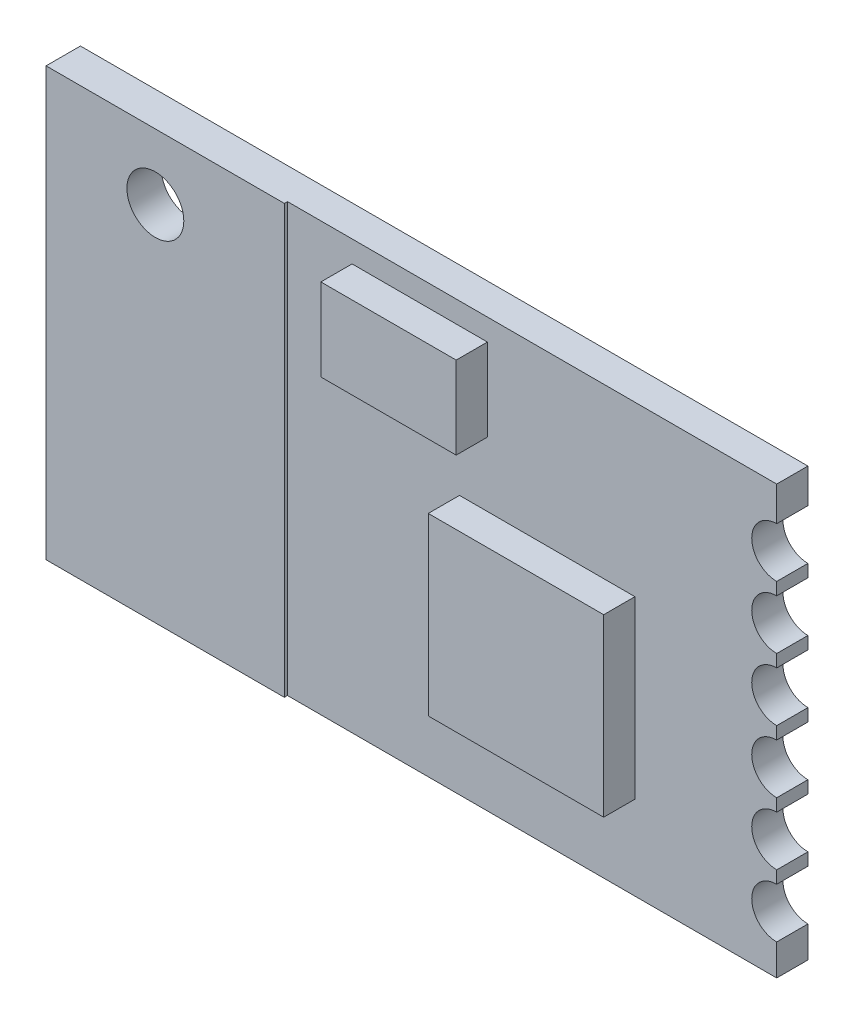
ISO-10303-21;
HEADER;
FILE_DESCRIPTION(('STEP AP214'),'2;1');
FILE_NAME('part.step','',(''),(''),'','','');
FILE_SCHEMA(('AUTOMOTIVE_DESIGN { 1 0 10303 214 1 1 1 1 }'));
ENDSEC;
DATA;
#1=APPLICATION_CONTEXT('core data for automotive mechanical design processes');
#2=APPLICATION_PROTOCOL_DEFINITION('international standard','automotive_design',2000,#1);
#3=PRODUCT_CONTEXT('',#1,'mechanical');
#4=PRODUCT('Part','Part','',(#3));
#5=PRODUCT_RELATED_PRODUCT_CATEGORY('part','',(#4));
#6=PRODUCT_DEFINITION_FORMATION('','',#4);
#7=PRODUCT_DEFINITION_CONTEXT('part definition',#1,'design');
#8=PRODUCT_DEFINITION('design','',#6,#7);
#9=PRODUCT_DEFINITION_SHAPE('','',#8);
#10=(LENGTH_UNIT() NAMED_UNIT(*) SI_UNIT(.MILLI.,.METRE.));
#11=(NAMED_UNIT(*) PLANE_ANGLE_UNIT() SI_UNIT($,.RADIAN.));
#12=(NAMED_UNIT(*) SI_UNIT($,.STERADIAN.) SOLID_ANGLE_UNIT());
#13=UNCERTAINTY_MEASURE_WITH_UNIT(LENGTH_MEASURE(1.E-05),#10,'distance_accuracy_value','');
#14=(GEOMETRIC_REPRESENTATION_CONTEXT(3) GLOBAL_UNCERTAINTY_ASSIGNED_CONTEXT((#13)) GLOBAL_UNIT_ASSIGNED_CONTEXT((#10,
#11,#12)) REPRESENTATION_CONTEXT('',''));
#15=CARTESIAN_POINT('',(0.,0.,0.));
#16=DIRECTION('',(0.,0.,1.));
#17=DIRECTION('',(1.,0.,0.));
#18=AXIS2_PLACEMENT_3D('',#15,#16,#17);
#19=CARTESIAN_POINT('',(23.3,-11.9,1.));
#20=DIRECTION('',(0.,0.,1.));
#21=DIRECTION('',(1.,0.,0.));
#22=AXIS2_PLACEMENT_3D('',#19,#20,#21);
#23=PLANE('',#22);
#24=DIRECTION('',(-1.,0.,0.));
#25=VECTOR('',#24,1.);
#26=CARTESIAN_POINT('',(0.,0.,1.));
#27=LINE('',#26,#25);
#28=CARTESIAN_POINT('',(23.3,0.,1.));
#29=VERTEX_POINT('',#28);
#30=CARTESIAN_POINT('',(7.63146684586983,0.,1.));
#31=VERTEX_POINT('',#30);
#32=EDGE_CURVE('E386',#29,#31,#27,.T.);
#33=ORIENTED_EDGE('',*,*,#32,.T.);
#34=DIRECTION('',(0.,-1.,0.));
#35=VECTOR('',#34,1.);
#36=CARTESIAN_POINT('',(7.63146684586983,0.,1.));
#37=LINE('',#36,#35);
#38=CARTESIAN_POINT('',(7.63146684586983,-13.7,1.));
#39=VERTEX_POINT('',#38);
#40=EDGE_CURVE('E310',#31,#39,#37,.T.);
#41=ORIENTED_EDGE('',*,*,#40,.T.);
#42=DIRECTION('',(1.,0.,0.));
#43=VECTOR('',#42,1.);
#44=CARTESIAN_POINT('',(0.,-13.7,1.));
#45=LINE('',#44,#43);
#46=CARTESIAN_POINT('',(23.3,-13.7,1.));
#47=VERTEX_POINT('',#46);
#48=EDGE_CURVE('E344',#39,#47,#45,.T.);
#49=ORIENTED_EDGE('',*,*,#48,.T.);
#50=DIRECTION('',(0.,1.,0.));
#51=VECTOR('',#50,1.);
#52=CARTESIAN_POINT('',(23.3,-12.7,1.));
#53=LINE('',#52,#51);
#54=CARTESIAN_POINT('',(23.3,-12.7,1.));
#55=VERTEX_POINT('',#54);
#56=EDGE_CURVE('E347',#47,#55,#53,.T.);
#57=ORIENTED_EDGE('',*,*,#56,.T.);
#58=CARTESIAN_POINT('',(23.3,-11.9,1.));
#59=DIRECTION('',(0.,0.,-1.));
#60=DIRECTION('',(1.,0.,0.));
#61=AXIS2_PLACEMENT_3D('',#58,#59,#60);
#62=CIRCLE('',#61,0.799999999999999);
#63=CARTESIAN_POINT('',(23.3,-11.1,1.));
#64=VERTEX_POINT('',#63);
#65=EDGE_CURVE('E351',#55,#64,#62,.T.);
#66=ORIENTED_EDGE('',*,*,#65,.T.);
#67=DIRECTION('',(0.,1.,0.));
#68=VECTOR('',#67,1.);
#69=CARTESIAN_POINT('',(23.3,-10.7,1.));
#70=LINE('',#69,#68);
#71=CARTESIAN_POINT('',(23.3,-10.7,1.));
#72=VERTEX_POINT('',#71);
#73=EDGE_CURVE('E354',#64,#72,#70,.T.);
#74=ORIENTED_EDGE('',*,*,#73,.T.);
#75=CARTESIAN_POINT('',(23.3,-9.9,1.));
#76=DIRECTION('',(0.,0.,-1.));
#77=DIRECTION('',(1.,0.,0.));
#78=AXIS2_PLACEMENT_3D('',#75,#76,#77);
#79=CIRCLE('',#78,0.799999999999999);
#80=CARTESIAN_POINT('',(23.3,-9.1,1.));
#81=VERTEX_POINT('',#80);
#82=EDGE_CURVE('E357',#72,#81,#79,.T.);
#83=ORIENTED_EDGE('',*,*,#82,.T.);
#84=DIRECTION('',(0.,1.,0.));
#85=VECTOR('',#84,1.);
#86=CARTESIAN_POINT('',(23.3,-8.7,1.));
#87=LINE('',#86,#85);
#88=CARTESIAN_POINT('',(23.3,-8.7,1.));
#89=VERTEX_POINT('',#88);
#90=EDGE_CURVE('E360',#81,#89,#87,.T.);
#91=ORIENTED_EDGE('',*,*,#90,.T.);
#92=CARTESIAN_POINT('',(23.3,-7.9,1.));
#93=DIRECTION('',(0.,0.,-1.));
#94=DIRECTION('',(1.,0.,0.));
#95=AXIS2_PLACEMENT_3D('',#92,#93,#94);
#96=CIRCLE('',#95,0.799999999999999);
#97=CARTESIAN_POINT('',(23.3,-7.1,1.));
#98=VERTEX_POINT('',#97);
#99=EDGE_CURVE('E363',#89,#98,#96,.T.);
#100=ORIENTED_EDGE('',*,*,#99,.T.);
#101=DIRECTION('',(0.,1.,0.));
#102=VECTOR('',#101,1.);
#103=CARTESIAN_POINT('',(23.3,-6.7,1.));
#104=LINE('',#103,#102);
#105=CARTESIAN_POINT('',(23.3,-6.7,1.));
#106=VERTEX_POINT('',#105);
#107=EDGE_CURVE('E366',#98,#106,#104,.T.);
#108=ORIENTED_EDGE('',*,*,#107,.T.);
#109=CARTESIAN_POINT('',(23.3,-5.9,1.));
#110=DIRECTION('',(0.,0.,-1.));
#111=DIRECTION('',(1.,0.,0.));
#112=AXIS2_PLACEMENT_3D('',#109,#110,#111);
#113=CIRCLE('',#112,0.799999999999999);
#114=CARTESIAN_POINT('',(23.3,-5.1,1.));
#115=VERTEX_POINT('',#114);
#116=EDGE_CURVE('E369',#106,#115,#113,.T.);
#117=ORIENTED_EDGE('',*,*,#116,.T.);
#118=DIRECTION('',(0.,1.,0.));
#119=VECTOR('',#118,1.);
#120=CARTESIAN_POINT('',(23.3,-4.7,1.));
#121=LINE('',#120,#119);
#122=CARTESIAN_POINT('',(23.3,-4.7,1.));
#123=VERTEX_POINT('',#122);
#124=EDGE_CURVE('E372',#115,#123,#121,.T.);
#125=ORIENTED_EDGE('',*,*,#124,.T.);
#126=CARTESIAN_POINT('',(23.3,-3.9,1.));
#127=DIRECTION('',(0.,0.,-1.));
#128=DIRECTION('',(1.,0.,0.));
#129=AXIS2_PLACEMENT_3D('',#126,#127,#128);
#130=CIRCLE('',#129,0.799999999999999);
#131=CARTESIAN_POINT('',(23.3,-3.1,1.));
#132=VERTEX_POINT('',#131);
#133=EDGE_CURVE('E375',#123,#132,#130,.T.);
#134=ORIENTED_EDGE('',*,*,#133,.T.);
#135=DIRECTION('',(0.,1.,0.));
#136=VECTOR('',#135,1.);
#137=CARTESIAN_POINT('',(23.3,-2.7,1.));
#138=LINE('',#137,#136);
#139=CARTESIAN_POINT('',(23.3,-2.7,1.));
#140=VERTEX_POINT('',#139);
#141=EDGE_CURVE('E378',#132,#140,#138,.T.);
#142=ORIENTED_EDGE('',*,*,#141,.T.);
#143=CARTESIAN_POINT('',(23.3,-1.9,1.));
#144=DIRECTION('',(0.,0.,-1.));
#145=DIRECTION('',(1.,0.,0.));
#146=AXIS2_PLACEMENT_3D('',#143,#144,#145);
#147=CIRCLE('',#146,0.799999999999998);
#148=CARTESIAN_POINT('',(23.3,-1.1,1.));
#149=VERTEX_POINT('',#148);
#150=EDGE_CURVE('E380',#140,#149,#147,.T.);
#151=ORIENTED_EDGE('',*,*,#150,.T.);
#152=DIRECTION('',(0.,1.,0.));
#153=VECTOR('',#152,1.);
#154=CARTESIAN_POINT('',(23.3,0.,1.));
#155=LINE('',#154,#153);
#156=EDGE_CURVE('E383',#149,#29,#155,.T.);
#157=ORIENTED_EDGE('',*,*,#156,.T.);
#158=EDGE_LOOP('',(#33,#41,#49,#57,#66,#74,#83,#91,#100,#108,#117,#125,#134,#142,#151,#157));
#159=FACE_BOUND('',#158,.T.);
#160=DIRECTION('',(-1.,0.,0.));
#161=VECTOR('',#160,1.);
#162=CARTESIAN_POINT('',(23.3,-11.0117848365072,1.));
#163=LINE('',#162,#161);
#164=CARTESIAN_POINT('',(18.7582826408663,-11.0117848365072,1.));
#165=VERTEX_POINT('',#164);
#166=CARTESIAN_POINT('',(13.1404463601816,-11.0117848365072,1.));
#167=VERTEX_POINT('',#166);
#168=EDGE_CURVE('E303',#165,#167,#163,.T.);
#169=ORIENTED_EDGE('',*,*,#168,.T.);
#170=DIRECTION('',(0.,1.,0.));
#171=VECTOR('',#170,1.);
#172=CARTESIAN_POINT('',(13.1404463601816,-11.9,1.));
#173=LINE('',#172,#171);
#174=CARTESIAN_POINT('',(13.1404463601816,-5.39394855582256,1.));
#175=VERTEX_POINT('',#174);
#176=EDGE_CURVE('E307',#167,#175,#173,.T.);
#177=ORIENTED_EDGE('',*,*,#176,.T.);
#178=DIRECTION('',(1.,0.,0.));
#179=VECTOR('',#178,1.);
#180=CARTESIAN_POINT('',(23.3,-5.39394855582256,1.));
#181=LINE('',#180,#179);
#182=CARTESIAN_POINT('',(18.7582826408663,-5.39394855582256,1.));
#183=VERTEX_POINT('',#182);
#184=EDGE_CURVE('E295',#175,#183,#181,.T.);
#185=ORIENTED_EDGE('',*,*,#184,.T.);
#186=DIRECTION('',(0.,-1.,0.));
#187=VECTOR('',#186,1.);
#188=CARTESIAN_POINT('',(18.7582826408663,-11.9,1.));
#189=LINE('',#188,#187);
#190=EDGE_CURVE('E299',#183,#165,#189,.T.);
#191=ORIENTED_EDGE('',*,*,#190,.T.);
#192=EDGE_LOOP('',(#169,#177,#185,#191));
#193=FACE_BOUND('',#192,.T.);
#194=DIRECTION('',(-1.,0.,0.));
#195=VECTOR('',#194,1.);
#196=CARTESIAN_POINT('',(23.3,-3.33025359557106,1.));
#197=LINE('',#196,#195);
#198=CARTESIAN_POINT('',(14.0347141762906,-3.33025359557106,1.));
#199=VERTEX_POINT('',#198);
#200=CARTESIAN_POINT('',(9.70095475976247,-3.33025359557106,1.));
#201=VERTEX_POINT('',#200);
#202=EDGE_CURVE('E263',#199,#201,#197,.T.);
#203=ORIENTED_EDGE('',*,*,#202,.T.);
#204=DIRECTION('',(0.,1.,0.));
#205=VECTOR('',#204,1.);
#206=CARTESIAN_POINT('',(9.70095475976247,-11.9,1.));
#207=LINE('',#206,#205);
#208=CARTESIAN_POINT('',(9.70095475976247,-0.693310035249692,1.));
#209=VERTEX_POINT('',#208);
#210=EDGE_CURVE('E245',#201,#209,#207,.T.);
#211=ORIENTED_EDGE('',*,*,#210,.T.);
#212=DIRECTION('',(1.,0.,0.));
#213=VECTOR('',#212,1.);
#214=CARTESIAN_POINT('',(23.3,-0.693310035249693,1.));
#215=LINE('',#214,#213);
#216=CARTESIAN_POINT('',(14.0347141762906,-0.693310035249693,1.));
#217=VERTEX_POINT('',#216);
#218=EDGE_CURVE('E247',#209,#217,#215,.T.);
#219=ORIENTED_EDGE('',*,*,#218,.T.);
#220=DIRECTION('',(0.,-1.,0.));
#221=VECTOR('',#220,1.);
#222=CARTESIAN_POINT('',(14.0347141762906,-11.9,1.));
#223=LINE('',#222,#221);
#224=EDGE_CURVE('E254',#217,#199,#223,.T.);
#225=ORIENTED_EDGE('',*,*,#224,.T.);
#226=EDGE_LOOP('',(#203,#211,#219,#225));
#227=FACE_BOUND('',#226,.T.);
#228=ADVANCED_FACE('F45',(#159,#193,#227),#23,.T.);
#229=CARTESIAN_POINT('',(23.3,-11.9,0.));
#230=DIRECTION('',(0.,0.,1.));
#231=DIRECTION('',(1.,0.,0.));
#232=AXIS2_PLACEMENT_3D('',#229,#230,#231);
#233=PLANE('',#232);
#234=DIRECTION('',(0.,-1.,0.));
#235=VECTOR('',#234,1.);
#236=CARTESIAN_POINT('',(0.,0.,0.));
#237=LINE('',#236,#235);
#238=CARTESIAN_POINT('',(0.,0.,0.));
#239=VERTEX_POINT('',#238);
#240=CARTESIAN_POINT('',(0.,-13.7,0.));
#241=VERTEX_POINT('',#240);
#242=EDGE_CURVE('E343',#239,#241,#237,.T.);
#243=ORIENTED_EDGE('',*,*,#242,.F.);
#244=DIRECTION('',(-1.,0.,0.));
#245=VECTOR('',#244,1.);
#246=CARTESIAN_POINT('',(0.,0.,0.));
#247=LINE('',#246,#245);
#248=CARTESIAN_POINT('',(23.3,0.,0.));
#249=VERTEX_POINT('',#248);
#250=EDGE_CURVE('E348',#249,#239,#247,.T.);
#251=ORIENTED_EDGE('',*,*,#250,.F.);
#252=DIRECTION('',(0.,1.,0.));
#253=VECTOR('',#252,1.);
#254=CARTESIAN_POINT('',(23.3,0.,0.));
#255=LINE('',#254,#253);
#256=CARTESIAN_POINT('',(23.3,-1.1,0.));
#257=VERTEX_POINT('',#256);
#258=EDGE_CURVE('E433',#257,#249,#255,.T.);
#259=ORIENTED_EDGE('',*,*,#258,.F.);
#260=CARTESIAN_POINT('',(23.3,-1.9,0.));
#261=DIRECTION('',(0.,0.,-1.));
#262=DIRECTION('',(1.,0.,0.));
#263=AXIS2_PLACEMENT_3D('',#260,#261,#262);
#264=CIRCLE('',#263,0.799999999999998);
#265=CARTESIAN_POINT('',(23.3,-2.7,0.));
#266=VERTEX_POINT('',#265);
#267=EDGE_CURVE('E430',#266,#257,#264,.T.);
#268=ORIENTED_EDGE('',*,*,#267,.F.);
#269=DIRECTION('',(0.,1.,0.));
#270=VECTOR('',#269,1.);
#271=CARTESIAN_POINT('',(23.3,-2.7,0.));
#272=LINE('',#271,#270);
#273=CARTESIAN_POINT('',(23.3,-3.1,0.));
#274=VERTEX_POINT('',#273);
#275=EDGE_CURVE('E427',#274,#266,#272,.T.);
#276=ORIENTED_EDGE('',*,*,#275,.F.);
#277=CARTESIAN_POINT('',(23.3,-3.9,0.));
#278=DIRECTION('',(0.,0.,-1.));
#279=DIRECTION('',(1.,0.,0.));
#280=AXIS2_PLACEMENT_3D('',#277,#278,#279);
#281=CIRCLE('',#280,0.799999999999999);
#282=CARTESIAN_POINT('',(23.3,-4.7,0.));
#283=VERTEX_POINT('',#282);
#284=EDGE_CURVE('E424',#283,#274,#281,.T.);
#285=ORIENTED_EDGE('',*,*,#284,.F.);
#286=DIRECTION('',(0.,1.,0.));
#287=VECTOR('',#286,1.);
#288=CARTESIAN_POINT('',(23.3,-4.7,0.));
#289=LINE('',#288,#287);
#290=CARTESIAN_POINT('',(23.3,-5.1,0.));
#291=VERTEX_POINT('',#290);
#292=EDGE_CURVE('E421',#291,#283,#289,.T.);
#293=ORIENTED_EDGE('',*,*,#292,.F.);
#294=CARTESIAN_POINT('',(23.3,-5.9,0.));
#295=DIRECTION('',(0.,0.,-1.));
#296=DIRECTION('',(1.,0.,0.));
#297=AXIS2_PLACEMENT_3D('',#294,#295,#296);
#298=CIRCLE('',#297,0.799999999999999);
#299=CARTESIAN_POINT('',(23.3,-6.7,0.));
#300=VERTEX_POINT('',#299);
#301=EDGE_CURVE('E418',#300,#291,#298,.T.);
#302=ORIENTED_EDGE('',*,*,#301,.F.);
#303=DIRECTION('',(0.,1.,0.));
#304=VECTOR('',#303,1.);
#305=CARTESIAN_POINT('',(23.3,-6.7,0.));
#306=LINE('',#305,#304);
#307=CARTESIAN_POINT('',(23.3,-7.1,0.));
#308=VERTEX_POINT('',#307);
#309=EDGE_CURVE('E415',#308,#300,#306,.T.);
#310=ORIENTED_EDGE('',*,*,#309,.F.);
#311=CARTESIAN_POINT('',(23.3,-7.9,0.));
#312=DIRECTION('',(0.,0.,-1.));
#313=DIRECTION('',(1.,0.,0.));
#314=AXIS2_PLACEMENT_3D('',#311,#312,#313);
#315=CIRCLE('',#314,0.799999999999999);
#316=CARTESIAN_POINT('',(23.3,-8.7,0.));
#317=VERTEX_POINT('',#316);
#318=EDGE_CURVE('E412',#317,#308,#315,.T.);
#319=ORIENTED_EDGE('',*,*,#318,.F.);
#320=DIRECTION('',(0.,1.,0.));
#321=VECTOR('',#320,1.);
#322=CARTESIAN_POINT('',(23.3,-8.7,0.));
#323=LINE('',#322,#321);
#324=CARTESIAN_POINT('',(23.3,-9.1,0.));
#325=VERTEX_POINT('',#324);
#326=EDGE_CURVE('E409',#325,#317,#323,.T.);
#327=ORIENTED_EDGE('',*,*,#326,.F.);
#328=CARTESIAN_POINT('',(23.3,-9.9,0.));
#329=DIRECTION('',(0.,0.,-1.));
#330=DIRECTION('',(1.,0.,0.));
#331=AXIS2_PLACEMENT_3D('',#328,#329,#330);
#332=CIRCLE('',#331,0.799999999999999);
#333=CARTESIAN_POINT('',(23.3,-10.7,0.));
#334=VERTEX_POINT('',#333);
#335=EDGE_CURVE('E406',#334,#325,#332,.T.);
#336=ORIENTED_EDGE('',*,*,#335,.F.);
#337=DIRECTION('',(0.,1.,0.));
#338=VECTOR('',#337,1.);
#339=CARTESIAN_POINT('',(23.3,-10.7,0.));
#340=LINE('',#339,#338);
#341=CARTESIAN_POINT('',(23.3,-11.1,0.));
#342=VERTEX_POINT('',#341);
#343=EDGE_CURVE('E403',#342,#334,#340,.T.);
#344=ORIENTED_EDGE('',*,*,#343,.F.);
#345=CARTESIAN_POINT('',(23.3,-11.9,0.));
#346=DIRECTION('',(0.,0.,-1.));
#347=DIRECTION('',(1.,0.,0.));
#348=AXIS2_PLACEMENT_3D('',#345,#346,#347);
#349=CIRCLE('',#348,0.799999999999999);
#350=CARTESIAN_POINT('',(23.3,-12.7,0.));
#351=VERTEX_POINT('',#350);
#352=EDGE_CURVE('E400',#351,#342,#349,.T.);
#353=ORIENTED_EDGE('',*,*,#352,.F.);
#354=DIRECTION('',(0.,1.,0.));
#355=VECTOR('',#354,1.);
#356=CARTESIAN_POINT('',(23.3,-12.7,0.));
#357=LINE('',#356,#355);
#358=CARTESIAN_POINT('',(23.3,-13.7,0.));
#359=VERTEX_POINT('',#358);
#360=EDGE_CURVE('E397',#359,#351,#357,.T.);
#361=ORIENTED_EDGE('',*,*,#360,.F.);
#362=DIRECTION('',(1.,0.,0.));
#363=VECTOR('',#362,1.);
#364=CARTESIAN_POINT('',(0.,-13.7,0.));
#365=LINE('',#364,#363);
#366=EDGE_CURVE('E394',#241,#359,#365,.T.);
#367=ORIENTED_EDGE('',*,*,#366,.F.);
#368=EDGE_LOOP('',(#243,#251,#259,#268,#276,#285,#293,#302,#310,#319,#327,#336,#344,#353,#361,#367));
#369=FACE_BOUND('',#368,.T.);
#370=CARTESIAN_POINT('',(3.5,-2.1,0.));
#371=DIRECTION('',(0.,0.,1.));
#372=DIRECTION('',(1.,0.,0.));
#373=AXIS2_PLACEMENT_3D('',#370,#371,#372);
#374=CIRCLE('',#373,0.911145060736606);
#375=CARTESIAN_POINT('',(4.41114506073661,-2.1,0.));
#376=VERTEX_POINT('',#375);
#377=EDGE_CURVE('E339',#376,#376,#374,.T.);
#378=ORIENTED_EDGE('',*,*,#377,.T.);
#379=EDGE_LOOP('',(#378));
#380=FACE_BOUND('',#379,.T.);
#381=ADVANCED_FACE('F506',(#369,#380),#233,.F.);
#382=CARTESIAN_POINT('',(0.,0.,1.));
#383=DIRECTION('',(1.,0.,0.));
#384=DIRECTION('',(0.,1.,0.));
#385=AXIS2_PLACEMENT_3D('',#382,#383,#384);
#386=PLANE('',#385);
#387=ORIENTED_EDGE('',*,*,#242,.T.);
#388=DIRECTION('',(0.,0.,-1.));
#389=VECTOR('',#388,1.);
#390=CARTESIAN_POINT('',(0.,-13.7,1.));
#391=LINE('',#390,#389);
#392=CARTESIAN_POINT('',(0.,-13.7,1.1));
#393=VERTEX_POINT('',#392);
#394=EDGE_CURVE('E11',#393,#241,#391,.T.);
#395=ORIENTED_EDGE('',*,*,#394,.F.);
#396=DIRECTION('',(0.,-1.,0.));
#397=VECTOR('',#396,1.);
#398=CARTESIAN_POINT('',(0.,0.,1.1));
#399=LINE('',#398,#397);
#400=CARTESIAN_POINT('',(0.,0.,1.1));
#401=VERTEX_POINT('',#400);
#402=EDGE_CURVE('E319',#401,#393,#399,.T.);
#403=ORIENTED_EDGE('',*,*,#402,.F.);
#404=DIRECTION('',(0.,0.,-1.));
#405=VECTOR('',#404,1.);
#406=CARTESIAN_POINT('',(0.,0.,1.));
#407=LINE('',#406,#405);
#408=EDGE_CURVE('E390',#401,#239,#407,.T.);
#409=ORIENTED_EDGE('',*,*,#408,.T.);
#410=EDGE_LOOP('',(#387,#395,#403,#409));
#411=FACE_BOUND('',#410,.T.);
#412=ADVANCED_FACE('F47',(#411),#386,.F.);
#413=CARTESIAN_POINT('',(0.,-13.7,1.));
#414=DIRECTION('',(0.,1.,0.));
#415=DIRECTION('',(0.,0.,1.));
#416=AXIS2_PLACEMENT_3D('',#413,#414,#415);
#417=PLANE('',#416);
#418=ORIENTED_EDGE('',*,*,#366,.T.);
#419=DIRECTION('',(0.,0.,-1.));
#420=VECTOR('',#419,1.);
#421=CARTESIAN_POINT('',(23.3,-13.7,1.));
#422=LINE('',#421,#420);
#423=EDGE_CURVE('E54',#47,#359,#422,.T.);
#424=ORIENTED_EDGE('',*,*,#423,.F.);
#425=ORIENTED_EDGE('',*,*,#48,.F.);
#426=DIRECTION('',(0.,0.,-1.));
#427=VECTOR('',#426,1.);
#428=CARTESIAN_POINT('',(7.63146684586983,-13.7,1.1));
#429=LINE('',#428,#427);
#430=CARTESIAN_POINT('',(7.63146684586983,-13.7,1.1));
#431=VERTEX_POINT('',#430);
#432=EDGE_CURVE('E330',#431,#39,#429,.T.);
#433=ORIENTED_EDGE('',*,*,#432,.F.);
#434=DIRECTION('',(1.,0.,0.));
#435=VECTOR('',#434,1.);
#436=CARTESIAN_POINT('',(0.,-13.7,1.1));
#437=LINE('',#436,#435);
#438=EDGE_CURVE('E323',#393,#431,#437,.T.);
#439=ORIENTED_EDGE('',*,*,#438,.F.);
#440=ORIENTED_EDGE('',*,*,#394,.T.);
#441=EDGE_LOOP('',(#418,#424,#425,#433,#439,#440));
#442=FACE_BOUND('',#441,.T.);
#443=ADVANCED_FACE('F524',(#442),#417,.F.);
#444=CARTESIAN_POINT('',(23.3,-12.7,1.));
#445=DIRECTION('',(-1.,0.,0.));
#446=DIRECTION('',(0.,0.,1.));
#447=AXIS2_PLACEMENT_3D('',#444,#445,#446);
#448=PLANE('',#447);
#449=ORIENTED_EDGE('',*,*,#360,.T.);
#450=DIRECTION('',(0.,0.,-1.));
#451=VECTOR('',#450,1.);
#452=CARTESIAN_POINT('',(23.3,-12.7,1.));
#453=LINE('',#452,#451);
#454=EDGE_CURVE('E489',#55,#351,#453,.T.);
#455=ORIENTED_EDGE('',*,*,#454,.F.);
#456=ORIENTED_EDGE('',*,*,#56,.F.);
#457=ORIENTED_EDGE('',*,*,#423,.T.);
#458=EDGE_LOOP('',(#449,#455,#456,#457));
#459=FACE_BOUND('',#458,.T.);
#460=ADVANCED_FACE('F499',(#459),#448,.F.);
#461=CARTESIAN_POINT('',(23.3,-11.9,1.));
#462=DIRECTION('',(0.,0.,-1.));
#463=DIRECTION('',(-1.,0.,0.));
#464=AXIS2_PLACEMENT_3D('',#461,#462,#463);
#465=CYLINDRICAL_SURFACE('',#464,0.799999999999999);
#466=ORIENTED_EDGE('',*,*,#352,.T.);
#467=DIRECTION('',(0.,0.,-1.));
#468=VECTOR('',#467,1.);
#469=CARTESIAN_POINT('',(23.3,-11.1,1.));
#470=LINE('',#469,#468);
#471=EDGE_CURVE('E485',#64,#342,#470,.T.);
#472=ORIENTED_EDGE('',*,*,#471,.F.);
#473=ORIENTED_EDGE('',*,*,#65,.F.);
#474=ORIENTED_EDGE('',*,*,#454,.T.);
#475=EDGE_LOOP('',(#466,#472,#473,#474));
#476=FACE_BOUND('',#475,.T.);
#477=ADVANCED_FACE('F512',(#476),#465,.F.);
#478=CARTESIAN_POINT('',(23.3,-10.7,1.));
#479=DIRECTION('',(-1.,0.,0.));
#480=DIRECTION('',(0.,0.,1.));
#481=AXIS2_PLACEMENT_3D('',#478,#479,#480);
#482=PLANE('',#481);
#483=ORIENTED_EDGE('',*,*,#343,.T.);
#484=DIRECTION('',(0.,0.,-1.));
#485=VECTOR('',#484,1.);
#486=CARTESIAN_POINT('',(23.3,-10.7,1.));
#487=LINE('',#486,#485);
#488=EDGE_CURVE('E481',#72,#334,#487,.T.);
#489=ORIENTED_EDGE('',*,*,#488,.F.);
#490=ORIENTED_EDGE('',*,*,#73,.F.);
#491=ORIENTED_EDGE('',*,*,#471,.T.);
#492=EDGE_LOOP('',(#483,#489,#490,#491));
#493=FACE_BOUND('',#492,.T.);
#494=ADVANCED_FACE('F516',(#493),#482,.F.);
#495=CARTESIAN_POINT('',(23.3,-9.9,1.));
#496=DIRECTION('',(0.,0.,-1.));
#497=DIRECTION('',(-1.,0.,0.));
#498=AXIS2_PLACEMENT_3D('',#495,#496,#497);
#499=CYLINDRICAL_SURFACE('',#498,0.799999999999999);
#500=ORIENTED_EDGE('',*,*,#335,.T.);
#501=DIRECTION('',(0.,0.,-1.));
#502=VECTOR('',#501,1.);
#503=CARTESIAN_POINT('',(23.3,-9.1,1.));
#504=LINE('',#503,#502);
#505=EDGE_CURVE('E477',#81,#325,#504,.T.);
#506=ORIENTED_EDGE('',*,*,#505,.F.);
#507=ORIENTED_EDGE('',*,*,#82,.F.);
#508=ORIENTED_EDGE('',*,*,#488,.T.);
#509=EDGE_LOOP('',(#500,#506,#507,#508));
#510=FACE_BOUND('',#509,.T.);
#511=ADVANCED_FACE('F585',(#510),#499,.F.);
#512=CARTESIAN_POINT('',(23.3,-8.7,1.));
#513=DIRECTION('',(-1.,0.,0.));
#514=DIRECTION('',(0.,0.,1.));
#515=AXIS2_PLACEMENT_3D('',#512,#513,#514);
#516=PLANE('',#515);
#517=ORIENTED_EDGE('',*,*,#326,.T.);
#518=DIRECTION('',(0.,0.,-1.));
#519=VECTOR('',#518,1.);
#520=CARTESIAN_POINT('',(23.3,-8.7,1.));
#521=LINE('',#520,#519);
#522=EDGE_CURVE('E473',#89,#317,#521,.T.);
#523=ORIENTED_EDGE('',*,*,#522,.F.);
#524=ORIENTED_EDGE('',*,*,#90,.F.);
#525=ORIENTED_EDGE('',*,*,#505,.T.);
#526=EDGE_LOOP('',(#517,#523,#524,#525));
#527=FACE_BOUND('',#526,.T.);
#528=ADVANCED_FACE('F582',(#527),#516,.F.);
#529=CARTESIAN_POINT('',(23.3,-7.9,1.));
#530=DIRECTION('',(0.,0.,-1.));
#531=DIRECTION('',(-1.,0.,0.));
#532=AXIS2_PLACEMENT_3D('',#529,#530,#531);
#533=CYLINDRICAL_SURFACE('',#532,0.799999999999999);
#534=ORIENTED_EDGE('',*,*,#318,.T.);
#535=DIRECTION('',(0.,0.,-1.));
#536=VECTOR('',#535,1.);
#537=CARTESIAN_POINT('',(23.3,-7.1,1.));
#538=LINE('',#537,#536);
#539=EDGE_CURVE('E469',#98,#308,#538,.T.);
#540=ORIENTED_EDGE('',*,*,#539,.F.);
#541=ORIENTED_EDGE('',*,*,#99,.F.);
#542=ORIENTED_EDGE('',*,*,#522,.T.);
#543=EDGE_LOOP('',(#534,#540,#541,#542));
#544=FACE_BOUND('',#543,.T.);
#545=ADVANCED_FACE('F578',(#544),#533,.F.);
#546=CARTESIAN_POINT('',(23.3,-6.7,1.));
#547=DIRECTION('',(-1.,0.,0.));
#548=DIRECTION('',(0.,0.,1.));
#549=AXIS2_PLACEMENT_3D('',#546,#547,#548);
#550=PLANE('',#549);
#551=ORIENTED_EDGE('',*,*,#309,.T.);
#552=DIRECTION('',(0.,0.,-1.));
#553=VECTOR('',#552,1.);
#554=CARTESIAN_POINT('',(23.3,-6.7,1.));
#555=LINE('',#554,#553);
#556=EDGE_CURVE('E465',#106,#300,#555,.T.);
#557=ORIENTED_EDGE('',*,*,#556,.F.);
#558=ORIENTED_EDGE('',*,*,#107,.F.);
#559=ORIENTED_EDGE('',*,*,#539,.T.);
#560=EDGE_LOOP('',(#551,#557,#558,#559));
#561=FACE_BOUND('',#560,.T.);
#562=ADVANCED_FACE('F574',(#561),#550,.F.);
#563=CARTESIAN_POINT('',(23.3,-5.9,1.));
#564=DIRECTION('',(0.,0.,-1.));
#565=DIRECTION('',(-1.,0.,0.));
#566=AXIS2_PLACEMENT_3D('',#563,#564,#565);
#567=CYLINDRICAL_SURFACE('',#566,0.799999999999999);
#568=ORIENTED_EDGE('',*,*,#301,.T.);
#569=DIRECTION('',(0.,0.,-1.));
#570=VECTOR('',#569,1.);
#571=CARTESIAN_POINT('',(23.3,-5.1,1.));
#572=LINE('',#571,#570);
#573=EDGE_CURVE('E461',#115,#291,#572,.T.);
#574=ORIENTED_EDGE('',*,*,#573,.F.);
#575=ORIENTED_EDGE('',*,*,#116,.F.);
#576=ORIENTED_EDGE('',*,*,#556,.T.);
#577=EDGE_LOOP('',(#568,#574,#575,#576));
#578=FACE_BOUND('',#577,.T.);
#579=ADVANCED_FACE('F569',(#578),#567,.F.);
#580=CARTESIAN_POINT('',(23.3,-4.7,1.));
#581=DIRECTION('',(-1.,0.,0.));
#582=DIRECTION('',(0.,0.,1.));
#583=AXIS2_PLACEMENT_3D('',#580,#581,#582);
#584=PLANE('',#583);
#585=ORIENTED_EDGE('',*,*,#292,.T.);
#586=DIRECTION('',(0.,0.,-1.));
#587=VECTOR('',#586,1.);
#588=CARTESIAN_POINT('',(23.3,-4.7,1.));
#589=LINE('',#588,#587);
#590=EDGE_CURVE('E457',#123,#283,#589,.T.);
#591=ORIENTED_EDGE('',*,*,#590,.F.);
#592=ORIENTED_EDGE('',*,*,#124,.F.);
#593=ORIENTED_EDGE('',*,*,#573,.T.);
#594=EDGE_LOOP('',(#585,#591,#592,#593));
#595=FACE_BOUND('',#594,.T.);
#596=ADVANCED_FACE('F563',(#595),#584,.F.);
#597=CARTESIAN_POINT('',(23.3,-3.9,1.));
#598=DIRECTION('',(0.,0.,-1.));
#599=DIRECTION('',(-1.,0.,0.));
#600=AXIS2_PLACEMENT_3D('',#597,#598,#599);
#601=CYLINDRICAL_SURFACE('',#600,0.799999999999999);
#602=ORIENTED_EDGE('',*,*,#284,.T.);
#603=DIRECTION('',(0.,0.,-1.));
#604=VECTOR('',#603,1.);
#605=CARTESIAN_POINT('',(23.3,-3.1,1.));
#606=LINE('',#605,#604);
#607=EDGE_CURVE('E453',#132,#274,#606,.T.);
#608=ORIENTED_EDGE('',*,*,#607,.F.);
#609=ORIENTED_EDGE('',*,*,#133,.F.);
#610=ORIENTED_EDGE('',*,*,#590,.T.);
#611=EDGE_LOOP('',(#602,#608,#609,#610));
#612=FACE_BOUND('',#611,.T.);
#613=ADVANCED_FACE('F559',(#612),#601,.F.);
#614=CARTESIAN_POINT('',(23.3,-2.7,1.));
#615=DIRECTION('',(-1.,0.,0.));
#616=DIRECTION('',(0.,0.,1.));
#617=AXIS2_PLACEMENT_3D('',#614,#615,#616);
#618=PLANE('',#617);
#619=ORIENTED_EDGE('',*,*,#275,.T.);
#620=DIRECTION('',(0.,0.,-1.));
#621=VECTOR('',#620,1.);
#622=CARTESIAN_POINT('',(23.3,-2.7,1.));
#623=LINE('',#622,#621);
#624=EDGE_CURVE('E449',#140,#266,#623,.T.);
#625=ORIENTED_EDGE('',*,*,#624,.F.);
#626=ORIENTED_EDGE('',*,*,#141,.F.);
#627=ORIENTED_EDGE('',*,*,#607,.T.);
#628=EDGE_LOOP('',(#619,#625,#626,#627));
#629=FACE_BOUND('',#628,.T.);
#630=ADVANCED_FACE('F554',(#629),#618,.F.);
#631=CARTESIAN_POINT('',(23.3,-1.9,1.));
#632=DIRECTION('',(0.,0.,-1.));
#633=DIRECTION('',(-1.,0.,0.));
#634=AXIS2_PLACEMENT_3D('',#631,#632,#633);
#635=CYLINDRICAL_SURFACE('',#634,0.799999999999998);
#636=ORIENTED_EDGE('',*,*,#267,.T.);
#637=DIRECTION('',(0.,0.,-1.));
#638=VECTOR('',#637,1.);
#639=CARTESIAN_POINT('',(23.3,-1.1,1.));
#640=LINE('',#639,#638);
#641=EDGE_CURVE('E445',#149,#257,#640,.T.);
#642=ORIENTED_EDGE('',*,*,#641,.F.);
#643=ORIENTED_EDGE('',*,*,#150,.F.);
#644=ORIENTED_EDGE('',*,*,#624,.T.);
#645=EDGE_LOOP('',(#636,#642,#643,#644));
#646=FACE_BOUND('',#645,.T.);
#647=ADVANCED_FACE('F548',(#646),#635,.F.);
#648=CARTESIAN_POINT('',(23.3,0.,1.));
#649=DIRECTION('',(-1.,0.,0.));
#650=DIRECTION('',(0.,0.,1.));
#651=AXIS2_PLACEMENT_3D('',#648,#649,#650);
#652=PLANE('',#651);
#653=ORIENTED_EDGE('',*,*,#258,.T.);
#654=DIRECTION('',(0.,0.,-1.));
#655=VECTOR('',#654,1.);
#656=CARTESIAN_POINT('',(23.3,0.,1.));
#657=LINE('',#656,#655);
#658=EDGE_CURVE('E441',#29,#249,#657,.T.);
#659=ORIENTED_EDGE('',*,*,#658,.F.);
#660=ORIENTED_EDGE('',*,*,#156,.F.);
#661=ORIENTED_EDGE('',*,*,#641,.T.);
#662=EDGE_LOOP('',(#653,#659,#660,#661));
#663=FACE_BOUND('',#662,.T.);
#664=ADVANCED_FACE('F544',(#663),#652,.F.);
#665=CARTESIAN_POINT('',(0.,0.,1.));
#666=DIRECTION('',(0.,-1.,0.));
#667=DIRECTION('',(1.,0.,0.));
#668=AXIS2_PLACEMENT_3D('',#665,#666,#667);
#669=PLANE('',#668);
#670=ORIENTED_EDGE('',*,*,#250,.T.);
#671=ORIENTED_EDGE('',*,*,#408,.F.);
#672=DIRECTION('',(-1.,0.,0.));
#673=VECTOR('',#672,1.);
#674=CARTESIAN_POINT('',(0.,0.,1.1));
#675=LINE('',#674,#673);
#676=CARTESIAN_POINT('',(7.63146684586983,0.,1.1));
#677=VERTEX_POINT('',#676);
#678=EDGE_CURVE('E315',#677,#401,#675,.T.);
#679=ORIENTED_EDGE('',*,*,#678,.F.);
#680=DIRECTION('',(0.,0.,-1.));
#681=VECTOR('',#680,1.);
#682=CARTESIAN_POINT('',(7.63146684586983,0.,1.1));
#683=LINE('',#682,#681);
#684=EDGE_CURVE('E336',#677,#31,#683,.T.);
#685=ORIENTED_EDGE('',*,*,#684,.T.);
#686=ORIENTED_EDGE('',*,*,#32,.F.);
#687=ORIENTED_EDGE('',*,*,#658,.T.);
#688=EDGE_LOOP('',(#670,#671,#679,#685,#686,#687));
#689=FACE_BOUND('',#688,.T.);
#690=ADVANCED_FACE('F539',(#689),#669,.F.);
#691=CARTESIAN_POINT('',(3.5,-2.1,1.));
#692=DIRECTION('',(0.,0.,-1.));
#693=DIRECTION('',(-1.,0.,0.));
#694=AXIS2_PLACEMENT_3D('',#691,#692,#693);
#695=CYLINDRICAL_SURFACE('',#694,0.911145060736606);
#696=ORIENTED_EDGE('',*,*,#377,.F.);
#697=EDGE_LOOP('',(#696));
#698=FACE_BOUND('',#697,.T.);
#699=CARTESIAN_POINT('',(3.5,-2.1,1.1));
#700=DIRECTION('',(0.,0.,1.));
#701=DIRECTION('',(1.,0.,0.));
#702=AXIS2_PLACEMENT_3D('',#699,#700,#701);
#703=CIRCLE('',#702,0.911145060736606);
#704=CARTESIAN_POINT('',(4.41114506073661,-2.1,1.1));
#705=VERTEX_POINT('',#704);
#706=EDGE_CURVE('E326',#705,#705,#703,.F.);
#707=ORIENTED_EDGE('',*,*,#706,.F.);
#708=EDGE_LOOP('',(#707));
#709=FACE_BOUND('',#708,.T.);
#710=ADVANCED_FACE('F601',(#698,#709),#695,.F.);
#711=CARTESIAN_POINT('',(7.63146684586983,0.,1.1));
#712=DIRECTION('',(1.,0.,0.));
#713=DIRECTION('',(0.,0.,-1.));
#714=AXIS2_PLACEMENT_3D('',#711,#712,#713);
#715=PLANE('',#714);
#716=ORIENTED_EDGE('',*,*,#40,.F.);
#717=ORIENTED_EDGE('',*,*,#684,.F.);
#718=DIRECTION('',(0.,-1.,0.));
#719=VECTOR('',#718,1.);
#720=CARTESIAN_POINT('',(7.63146684586983,0.,1.1));
#721=LINE('',#720,#719);
#722=EDGE_CURVE('E311',#677,#431,#721,.T.);
#723=ORIENTED_EDGE('',*,*,#722,.T.);
#724=ORIENTED_EDGE('',*,*,#432,.T.);
#725=EDGE_LOOP('',(#716,#717,#723,#724));
#726=FACE_BOUND('',#725,.T.);
#727=ADVANCED_FACE('F528',(#726),#715,.T.);
#728=CARTESIAN_POINT('',(0.,0.,1.1));
#729=DIRECTION('',(0.,0.,1.));
#730=DIRECTION('',(1.,0.,0.));
#731=AXIS2_PLACEMENT_3D('',#728,#729,#730);
#732=PLANE('',#731);
#733=ORIENTED_EDGE('',*,*,#722,.F.);
#734=ORIENTED_EDGE('',*,*,#678,.T.);
#735=ORIENTED_EDGE('',*,*,#402,.T.);
#736=ORIENTED_EDGE('',*,*,#438,.T.);
#737=EDGE_LOOP('',(#733,#734,#735,#736));
#738=FACE_BOUND('',#737,.T.);
#739=ORIENTED_EDGE('',*,*,#706,.T.);
#740=EDGE_LOOP('',(#739));
#741=FACE_BOUND('',#740,.T.);
#742=ADVANCED_FACE('F531',(#738,#741),#732,.T.);
#743=CARTESIAN_POINT('',(13.1404463601816,-5.39394855582256,2.));
#744=DIRECTION('',(1.,0.,0.));
#745=DIRECTION('',(0.,1.,0.));
#746=AXIS2_PLACEMENT_3D('',#743,#744,#745);
#747=PLANE('',#746);
#748=ORIENTED_EDGE('',*,*,#176,.F.);
#749=DIRECTION('',(0.,0.,-1.));
#750=VECTOR('',#749,1.);
#751=CARTESIAN_POINT('',(13.1404463601816,-11.0117848365072,2.));
#752=LINE('',#751,#750);
#753=CARTESIAN_POINT('',(13.1404463601816,-11.0117848365072,2.));
#754=VERTEX_POINT('',#753);
#755=EDGE_CURVE('E291',#754,#167,#752,.T.);
#756=ORIENTED_EDGE('',*,*,#755,.F.);
#757=DIRECTION('',(0.,-1.,0.));
#758=VECTOR('',#757,1.);
#759=CARTESIAN_POINT('',(13.1404463601816,-5.39394855582256,2.));
#760=LINE('',#759,#758);
#761=CARTESIAN_POINT('',(13.1404463601816,-5.39394855582256,2.));
#762=VERTEX_POINT('',#761);
#763=EDGE_CURVE('E268',#762,#754,#760,.T.);
#764=ORIENTED_EDGE('',*,*,#763,.F.);
#765=DIRECTION('',(0.,0.,-1.));
#766=VECTOR('',#765,1.);
#767=CARTESIAN_POINT('',(13.1404463601816,-5.39394855582256,2.));
#768=LINE('',#767,#766);
#769=EDGE_CURVE('E281',#762,#175,#768,.T.);
#770=ORIENTED_EDGE('',*,*,#769,.T.);
#771=EDGE_LOOP('',(#748,#756,#764,#770));
#772=FACE_BOUND('',#771,.T.);
#773=ADVANCED_FACE('F663',(#772),#747,.F.);
#774=CARTESIAN_POINT('',(13.1404463601816,-11.0117848365072,2.));
#775=DIRECTION('',(0.,1.,0.));
#776=DIRECTION('',(0.,0.,1.));
#777=AXIS2_PLACEMENT_3D('',#774,#775,#776);
#778=PLANE('',#777);
#779=ORIENTED_EDGE('',*,*,#168,.F.);
#780=DIRECTION('',(0.,0.,-1.));
#781=VECTOR('',#780,1.);
#782=CARTESIAN_POINT('',(18.7582826408663,-11.0117848365072,2.));
#783=LINE('',#782,#781);
#784=CARTESIAN_POINT('',(18.7582826408663,-11.0117848365072,2.));
#785=VERTEX_POINT('',#784);
#786=EDGE_CURVE('E287',#785,#165,#783,.T.);
#787=ORIENTED_EDGE('',*,*,#786,.F.);
#788=DIRECTION('',(1.,0.,0.));
#789=VECTOR('',#788,1.);
#790=CARTESIAN_POINT('',(13.1404463601816,-11.0117848365072,2.));
#791=LINE('',#790,#789);
#792=EDGE_CURVE('E272',#754,#785,#791,.T.);
#793=ORIENTED_EDGE('',*,*,#792,.F.);
#794=ORIENTED_EDGE('',*,*,#755,.T.);
#795=EDGE_LOOP('',(#779,#787,#793,#794));
#796=FACE_BOUND('',#795,.T.);
#797=ADVANCED_FACE('F669',(#796),#778,.F.);
#798=CARTESIAN_POINT('',(18.7582826408663,-5.39394855582256,2.));
#799=DIRECTION('',(-1.,0.,0.));
#800=DIRECTION('',(0.,0.,1.));
#801=AXIS2_PLACEMENT_3D('',#798,#799,#800);
#802=PLANE('',#801);
#803=ORIENTED_EDGE('',*,*,#190,.F.);
#804=DIRECTION('',(0.,0.,-1.));
#805=VECTOR('',#804,1.);
#806=CARTESIAN_POINT('',(18.7582826408663,-5.39394855582256,2.));
#807=LINE('',#806,#805);
#808=CARTESIAN_POINT('',(18.7582826408663,-5.39394855582256,2.));
#809=VERTEX_POINT('',#808);
#810=EDGE_CURVE('E69',#809,#183,#807,.T.);
#811=ORIENTED_EDGE('',*,*,#810,.F.);
#812=DIRECTION('',(0.,1.,0.));
#813=VECTOR('',#812,1.);
#814=CARTESIAN_POINT('',(18.7582826408663,-5.39394855582256,2.));
#815=LINE('',#814,#813);
#816=EDGE_CURVE('E275',#785,#809,#815,.T.);
#817=ORIENTED_EDGE('',*,*,#816,.F.);
#818=ORIENTED_EDGE('',*,*,#786,.T.);
#819=EDGE_LOOP('',(#803,#811,#817,#818));
#820=FACE_BOUND('',#819,.T.);
#821=ADVANCED_FACE('F676',(#820),#802,.F.);
#822=CARTESIAN_POINT('',(13.1404463601816,-5.39394855582256,2.));
#823=DIRECTION('',(0.,-1.,0.));
#824=DIRECTION('',(0.,0.,-1.));
#825=AXIS2_PLACEMENT_3D('',#822,#823,#824);
#826=PLANE('',#825);
#827=ORIENTED_EDGE('',*,*,#184,.F.);
#828=ORIENTED_EDGE('',*,*,#769,.F.);
#829=DIRECTION('',(-1.,0.,0.));
#830=VECTOR('',#829,1.);
#831=CARTESIAN_POINT('',(13.1404463601816,-5.39394855582256,2.));
#832=LINE('',#831,#830);
#833=EDGE_CURVE('E278',#809,#762,#832,.T.);
#834=ORIENTED_EDGE('',*,*,#833,.F.);
#835=ORIENTED_EDGE('',*,*,#810,.T.);
#836=EDGE_LOOP('',(#827,#828,#834,#835));
#837=FACE_BOUND('',#836,.T.);
#838=ADVANCED_FACE('F683',(#837),#826,.F.);
#839=CARTESIAN_POINT('',(0.,0.,2.));
#840=DIRECTION('',(0.,0.,1.));
#841=DIRECTION('',(1.,0.,0.));
#842=AXIS2_PLACEMENT_3D('',#839,#840,#841);
#843=PLANE('',#842);
#844=ORIENTED_EDGE('',*,*,#763,.T.);
#845=ORIENTED_EDGE('',*,*,#792,.T.);
#846=ORIENTED_EDGE('',*,*,#816,.T.);
#847=ORIENTED_EDGE('',*,*,#833,.T.);
#848=EDGE_LOOP('',(#844,#845,#846,#847));
#849=FACE_BOUND('',#848,.T.);
#850=ADVANCED_FACE('F690',(#849),#843,.T.);
#851=CARTESIAN_POINT('',(9.70095475976247,-0.693310035249692,2.));
#852=DIRECTION('',(1.,0.,0.));
#853=DIRECTION('',(0.,0.,-1.));
#854=AXIS2_PLACEMENT_3D('',#851,#852,#853);
#855=PLANE('',#854);
#856=ORIENTED_EDGE('',*,*,#210,.F.);
#857=DIRECTION('',(0.,0.,-1.));
#858=VECTOR('',#857,1.);
#859=CARTESIAN_POINT('',(9.70095475976247,-3.33025359557106,2.));
#860=LINE('',#859,#858);
#861=CARTESIAN_POINT('',(9.70095475976247,-3.33025359557106,2.));
#862=VERTEX_POINT('',#861);
#863=EDGE_CURVE('E225',#862,#201,#860,.T.);
#864=ORIENTED_EDGE('',*,*,#863,.F.);
#865=DIRECTION('',(0.,-1.,0.));
#866=VECTOR('',#865,1.);
#867=CARTESIAN_POINT('',(9.70095475976247,-0.693310035249692,2.));
#868=LINE('',#867,#866);
#869=CARTESIAN_POINT('',(9.70095475976247,-0.693310035249692,2.));
#870=VERTEX_POINT('',#869);
#871=EDGE_CURVE('E233',#870,#862,#868,.T.);
#872=ORIENTED_EDGE('',*,*,#871,.F.);
#873=DIRECTION('',(0.,0.,-1.));
#874=VECTOR('',#873,1.);
#875=CARTESIAN_POINT('',(9.70095475976247,-0.693310035249692,2.));
#876=LINE('',#875,#874);
#877=EDGE_CURVE('E901',#870,#209,#876,.T.);
#878=ORIENTED_EDGE('',*,*,#877,.T.);
#879=EDGE_LOOP('',(#856,#864,#872,#878));
#880=FACE_BOUND('',#879,.T.);
#881=ADVANCED_FACE('F243',(#880),#855,.F.);
#882=CARTESIAN_POINT('',(9.70095475976247,-3.33025359557106,2.));
#883=DIRECTION('',(0.,1.,0.));
#884=DIRECTION('',(0.,0.,1.));
#885=AXIS2_PLACEMENT_3D('',#882,#883,#884);
#886=PLANE('',#885);
#887=ORIENTED_EDGE('',*,*,#202,.F.);
#888=DIRECTION('',(0.,0.,-1.));
#889=VECTOR('',#888,1.);
#890=CARTESIAN_POINT('',(14.0347141762906,-3.33025359557106,2.));
#891=LINE('',#890,#889);
#892=CARTESIAN_POINT('',(14.0347141762906,-3.33025359557106,2.));
#893=VERTEX_POINT('',#892);
#894=EDGE_CURVE('E228',#893,#199,#891,.T.);
#895=ORIENTED_EDGE('',*,*,#894,.F.);
#896=DIRECTION('',(1.,0.,0.));
#897=VECTOR('',#896,1.);
#898=CARTESIAN_POINT('',(9.70095475976247,-3.33025359557106,2.));
#899=LINE('',#898,#897);
#900=EDGE_CURVE('E221',#862,#893,#899,.T.);
#901=ORIENTED_EDGE('',*,*,#900,.F.);
#902=ORIENTED_EDGE('',*,*,#863,.T.);
#903=EDGE_LOOP('',(#887,#895,#901,#902));
#904=FACE_BOUND('',#903,.T.);
#905=ADVANCED_FACE('F223',(#904),#886,.F.);
#906=CARTESIAN_POINT('',(14.0347141762906,-0.693310035249692,2.));
#907=DIRECTION('',(-1.,0.,0.));
#908=DIRECTION('',(0.,0.,1.));
#909=AXIS2_PLACEMENT_3D('',#906,#907,#908);
#910=PLANE('',#909);
#911=ORIENTED_EDGE('',*,*,#224,.F.);
#912=DIRECTION('',(0.,0.,-1.));
#913=VECTOR('',#912,1.);
#914=CARTESIAN_POINT('',(14.0347141762906,-0.693310035249692,2.));
#915=LINE('',#914,#913);
#916=CARTESIAN_POINT('',(14.0347141762906,-0.693310035249692,2.));
#917=VERTEX_POINT('',#916);
#918=EDGE_CURVE('E61',#917,#217,#915,.T.);
#919=ORIENTED_EDGE('',*,*,#918,.F.);
#920=DIRECTION('',(0.,1.,0.));
#921=VECTOR('',#920,1.);
#922=CARTESIAN_POINT('',(14.0347141762906,-0.693310035249692,2.));
#923=LINE('',#922,#921);
#924=EDGE_CURVE('E232',#893,#917,#923,.T.);
#925=ORIENTED_EDGE('',*,*,#924,.F.);
#926=ORIENTED_EDGE('',*,*,#894,.T.);
#927=EDGE_LOOP('',(#911,#919,#925,#926));
#928=FACE_BOUND('',#927,.T.);
#929=ADVANCED_FACE('F707',(#928),#910,.F.);
#930=CARTESIAN_POINT('',(9.70095475976247,-0.693310035249692,2.));
#931=DIRECTION('',(0.,-1.,0.));
#932=DIRECTION('',(0.,0.,-1.));
#933=AXIS2_PLACEMENT_3D('',#930,#931,#932);
#934=PLANE('',#933);
#935=ORIENTED_EDGE('',*,*,#218,.F.);
#936=ORIENTED_EDGE('',*,*,#877,.F.);
#937=DIRECTION('',(-1.,0.,0.));
#938=VECTOR('',#937,1.);
#939=CARTESIAN_POINT('',(9.70095475976247,-0.693310035249692,2.));
#940=LINE('',#939,#938);
#941=EDGE_CURVE('E237',#917,#870,#940,.T.);
#942=ORIENTED_EDGE('',*,*,#941,.F.);
#943=ORIENTED_EDGE('',*,*,#918,.T.);
#944=EDGE_LOOP('',(#935,#936,#942,#943));
#945=FACE_BOUND('',#944,.T.);
#946=ADVANCED_FACE('F713',(#945),#934,.F.);
#947=CARTESIAN_POINT('',(0.,0.,2.));
#948=DIRECTION('',(0.,0.,1.));
#949=DIRECTION('',(1.,0.,0.));
#950=AXIS2_PLACEMENT_3D('',#947,#948,#949);
#951=PLANE('',#950);
#952=ORIENTED_EDGE('',*,*,#871,.T.);
#953=ORIENTED_EDGE('',*,*,#900,.T.);
#954=ORIENTED_EDGE('',*,*,#924,.T.);
#955=ORIENTED_EDGE('',*,*,#941,.T.);
#956=EDGE_LOOP('',(#952,#953,#954,#955));
#957=FACE_BOUND('',#956,.T.);
#958=ADVANCED_FACE('F236',(#957),#951,.T.);
#959=CLOSED_SHELL('',(#228,#381,#412,#443,#460,#477,#494,#511,#528,#545,#562,#579,#596,#613,
#630,#647,#664,#690,#710,#727,#742,#773,#797,#821,#838,#850,#881,#905,#929,#946,#958));
#960=MANIFOLD_SOLID_BREP('B2',#959);
#961=ADVANCED_BREP_SHAPE_REPRESENTATION('',(#18,#960),#14);
#962=SHAPE_DEFINITION_REPRESENTATION(#9,#961);
ENDSEC;
END-ISO-10303-21;
